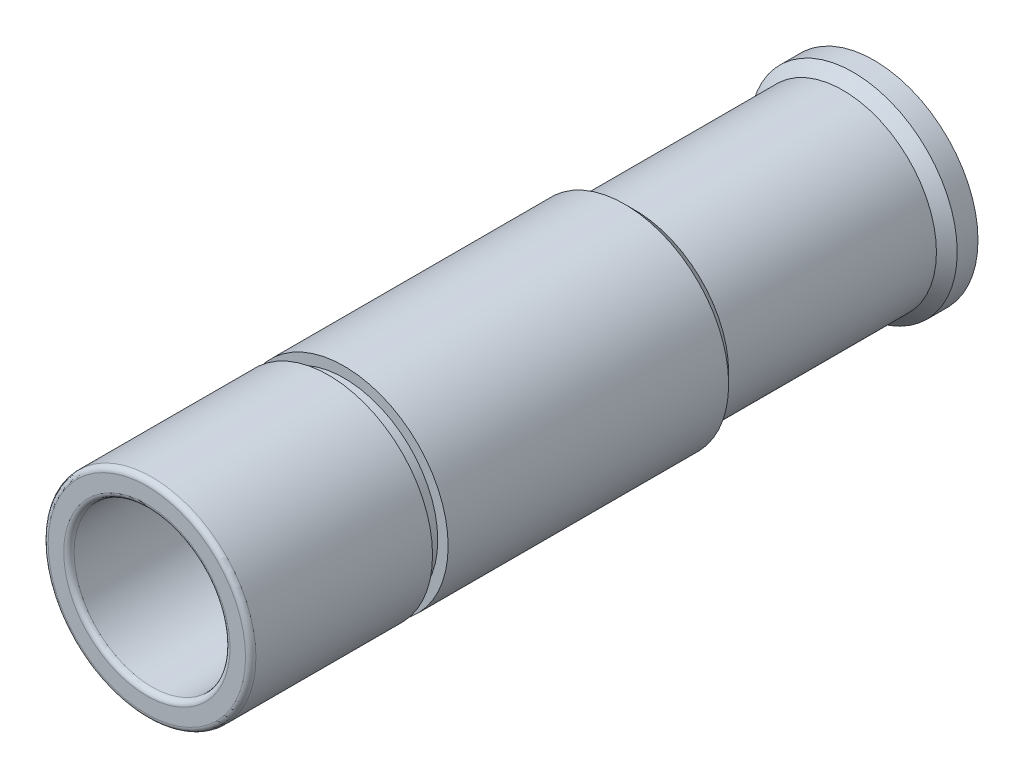
ISO-10303-21;
HEADER;
FILE_DESCRIPTION(('STEP AP214'),'2;1');
FILE_NAME('part.step','',(''),(''),'','','');
FILE_SCHEMA(('AUTOMOTIVE_DESIGN { 1 0 10303 214 1 1 1 1 }'));
ENDSEC;
DATA;
#1=APPLICATION_CONTEXT('core data for automotive mechanical design processes');
#2=APPLICATION_PROTOCOL_DEFINITION('international standard','automotive_design',2000,#1);
#3=PRODUCT_CONTEXT('',#1,'mechanical');
#4=PRODUCT('Part','Part','',(#3));
#5=PRODUCT_RELATED_PRODUCT_CATEGORY('part','',(#4));
#6=PRODUCT_DEFINITION_FORMATION('','',#4);
#7=PRODUCT_DEFINITION_CONTEXT('part definition',#1,'design');
#8=PRODUCT_DEFINITION('design','',#6,#7);
#9=PRODUCT_DEFINITION_SHAPE('','',#8);
#10=(LENGTH_UNIT() NAMED_UNIT(*) SI_UNIT(.MILLI.,.METRE.));
#11=(NAMED_UNIT(*) PLANE_ANGLE_UNIT() SI_UNIT($,.RADIAN.));
#12=(NAMED_UNIT(*) SI_UNIT($,.STERADIAN.) SOLID_ANGLE_UNIT());
#13=UNCERTAINTY_MEASURE_WITH_UNIT(LENGTH_MEASURE(1.E-05),#10,'distance_accuracy_value','');
#14=(GEOMETRIC_REPRESENTATION_CONTEXT(3) GLOBAL_UNCERTAINTY_ASSIGNED_CONTEXT((#13)) GLOBAL_UNIT_ASSIGNED_CONTEXT((#10,
#11,#12)) REPRESENTATION_CONTEXT('',''));
#15=CARTESIAN_POINT('',(0.,0.,0.));
#16=DIRECTION('',(0.,0.,1.));
#17=DIRECTION('',(1.,0.,0.));
#18=AXIS2_PLACEMENT_3D('',#15,#16,#17);
#19=CARTESIAN_POINT('',(0.,4.5,-8.75));
#20=DIRECTION('',(0.,0.,1.));
#21=DIRECTION('',(1.,0.,0.));
#22=AXIS2_PLACEMENT_3D('',#19,#20,#21);
#23=PLANE('',#22);
#24=CARTESIAN_POINT('',(0.,0.,-8.75));
#25=DIRECTION('',(0.,0.,1.));
#26=DIRECTION('',(1.,0.,0.));
#27=AXIS2_PLACEMENT_3D('',#24,#25,#26);
#28=CIRCLE('',#27,5.00000000000003);
#29=CARTESIAN_POINT('',(5.00000000000003,0.,-8.75));
#30=VERTEX_POINT('',#29);
#31=EDGE_CURVE('E79',#30,#30,#28,.T.);
#32=ORIENTED_EDGE('',*,*,#31,.F.);
#33=EDGE_LOOP('',(#32));
#34=FACE_BOUND('',#33,.T.);
#35=CARTESIAN_POINT('',(0.,0.,-8.75));
#36=DIRECTION('',(0.,0.,1.));
#37=DIRECTION('',(1.,0.,0.));
#38=AXIS2_PLACEMENT_3D('',#35,#36,#37);
#39=CIRCLE('',#38,4.50000000000003);
#40=CARTESIAN_POINT('',(4.50000000000003,0.,-8.75));
#41=VERTEX_POINT('',#40);
#42=EDGE_CURVE('E52',#41,#41,#39,.T.);
#43=ORIENTED_EDGE('',*,*,#42,.T.);
#44=EDGE_LOOP('',(#43));
#45=FACE_BOUND('',#44,.T.);
#46=ADVANCED_FACE('F32',(#34,#45),#23,.F.);
#47=CARTESIAN_POINT('',(0.,0.,-23.));
#48=DIRECTION('',(0.,0.,1.));
#49=DIRECTION('',(1.,0.,0.));
#50=AXIS2_PLACEMENT_3D('',#47,#48,#49);
#51=CYLINDRICAL_SURFACE('',#50,4.50000000000003);
#52=ORIENTED_EDGE('',*,*,#42,.F.);
#53=EDGE_LOOP('',(#52));
#54=FACE_BOUND('',#53,.T.);
#55=CARTESIAN_POINT('',(0.,0.,-9.5));
#56=DIRECTION('',(0.,0.,1.));
#57=DIRECTION('',(1.,0.,0.));
#58=AXIS2_PLACEMENT_3D('',#55,#56,#57);
#59=CIRCLE('',#58,4.50000000000003);
#60=CARTESIAN_POINT('',(4.50000000000003,0.,-9.5));
#61=VERTEX_POINT('',#60);
#62=EDGE_CURVE('E55',#61,#61,#59,.T.);
#63=ORIENTED_EDGE('',*,*,#62,.T.);
#64=EDGE_LOOP('',(#63));
#65=FACE_BOUND('',#64,.T.);
#66=ADVANCED_FACE('F87',(#54,#65),#51,.T.);
#67=CARTESIAN_POINT('',(0.,4.5,-9.5));
#68=DIRECTION('',(0.,0.,-1.));
#69=DIRECTION('',(-1.,0.,0.));
#70=AXIS2_PLACEMENT_3D('',#67,#68,#69);
#71=PLANE('',#70);
#72=ORIENTED_EDGE('',*,*,#62,.F.);
#73=EDGE_LOOP('',(#72));
#74=FACE_BOUND('',#73,.T.);
#75=CARTESIAN_POINT('',(0.,0.,-9.5));
#76=DIRECTION('',(0.,0.,1.));
#77=DIRECTION('',(1.,0.,0.));
#78=AXIS2_PLACEMENT_3D('',#75,#76,#77);
#79=CIRCLE('',#78,5.00000000000003);
#80=CARTESIAN_POINT('',(5.00000000000003,0.,-9.5));
#81=VERTEX_POINT('',#80);
#82=EDGE_CURVE('E58',#81,#81,#79,.T.);
#83=ORIENTED_EDGE('',*,*,#82,.T.);
#84=EDGE_LOOP('',(#83));
#85=FACE_BOUND('',#84,.T.);
#86=ADVANCED_FACE('F93',(#74,#85),#71,.F.);
#87=CARTESIAN_POINT('',(0.,0.,-23.));
#88=DIRECTION('',(0.,0.,1.));
#89=DIRECTION('',(1.,0.,0.));
#90=AXIS2_PLACEMENT_3D('',#87,#88,#89);
#91=CYLINDRICAL_SURFACE('',#90,5.00000000000003);
#92=ORIENTED_EDGE('',*,*,#82,.F.);
#93=EDGE_LOOP('',(#92));
#94=FACE_BOUND('',#93,.T.);
#95=CARTESIAN_POINT('',(0.,0.,-23.));
#96=DIRECTION('',(0.,0.,1.));
#97=DIRECTION('',(1.,0.,0.));
#98=AXIS2_PLACEMENT_3D('',#95,#96,#97);
#99=CIRCLE('',#98,5.00000000000003);
#100=CARTESIAN_POINT('',(5.00000000000003,0.,-23.));
#101=VERTEX_POINT('',#100);
#102=EDGE_CURVE('E61',#101,#101,#99,.T.);
#103=ORIENTED_EDGE('',*,*,#102,.T.);
#104=EDGE_LOOP('',(#103));
#105=FACE_BOUND('',#104,.T.);
#106=ADVANCED_FACE('F99',(#94,#105),#91,.T.);
#107=CARTESIAN_POINT('',(0.,0.,-23.5));
#108=DIRECTION('',(0.,0.,1.));
#109=DIRECTION('',(1.,0.,0.));
#110=AXIS2_PLACEMENT_3D('',#107,#108,#109);
#111=CONICAL_SURFACE('',#110,4.50000000000003,0.78539816339745);
#112=ORIENTED_EDGE('',*,*,#102,.F.);
#113=EDGE_LOOP('',(#112));
#114=FACE_BOUND('',#113,.T.);
#115=CARTESIAN_POINT('',(0.,0.,-23.5));
#116=DIRECTION('',(0.,0.,1.));
#117=DIRECTION('',(1.,0.,0.));
#118=AXIS2_PLACEMENT_3D('',#115,#116,#117);
#119=CIRCLE('',#118,4.50000000000003);
#120=CARTESIAN_POINT('',(4.50000000000003,0.,-23.5));
#121=VERTEX_POINT('',#120);
#122=EDGE_CURVE('E64',#121,#121,#119,.T.);
#123=ORIENTED_EDGE('',*,*,#122,.T.);
#124=EDGE_LOOP('',(#123));
#125=FACE_BOUND('',#124,.T.);
#126=ADVANCED_FACE('F105',(#114,#125),#111,.T.);
#127=CARTESIAN_POINT('',(0.,0.,-23.));
#128=DIRECTION('',(0.,0.,1.));
#129=DIRECTION('',(1.,0.,0.));
#130=AXIS2_PLACEMENT_3D('',#127,#128,#129);
#131=CYLINDRICAL_SURFACE('',#130,4.50000000000003);
#132=ORIENTED_EDGE('',*,*,#122,.F.);
#133=EDGE_LOOP('',(#132));
#134=FACE_BOUND('',#133,.T.);
#135=CARTESIAN_POINT('',(0.,0.,-33.5));
#136=DIRECTION('',(0.,0.,1.));
#137=DIRECTION('',(1.,0.,0.));
#138=AXIS2_PLACEMENT_3D('',#135,#136,#137);
#139=CIRCLE('',#138,4.50000000000003);
#140=CARTESIAN_POINT('',(4.50000000000003,0.,-33.5));
#141=VERTEX_POINT('',#140);
#142=EDGE_CURVE('E67',#141,#141,#139,.T.);
#143=ORIENTED_EDGE('',*,*,#142,.T.);
#144=EDGE_LOOP('',(#143));
#145=FACE_BOUND('',#144,.T.);
#146=ADVANCED_FACE('F111',(#134,#145),#131,.T.);
#147=CARTESIAN_POINT('',(0.,0.,-34.));
#148=DIRECTION('',(0.,0.,-1.));
#149=DIRECTION('',(-1.,0.,0.));
#150=AXIS2_PLACEMENT_3D('',#147,#148,#149);
#151=CONICAL_SURFACE('',#150,5.,0.785398163397447);
#152=ORIENTED_EDGE('',*,*,#142,.F.);
#153=EDGE_LOOP('',(#152));
#154=FACE_BOUND('',#153,.T.);
#155=CARTESIAN_POINT('',(0.,0.,-34.));
#156=DIRECTION('',(0.,0.,1.));
#157=DIRECTION('',(1.,0.,0.));
#158=AXIS2_PLACEMENT_3D('',#155,#156,#157);
#159=CIRCLE('',#158,5.);
#160=CARTESIAN_POINT('',(5.,0.,-34.));
#161=VERTEX_POINT('',#160);
#162=EDGE_CURVE('E70',#161,#161,#159,.T.);
#163=ORIENTED_EDGE('',*,*,#162,.T.);
#164=EDGE_LOOP('',(#163));
#165=FACE_BOUND('',#164,.T.);
#166=ADVANCED_FACE('F117',(#154,#165),#151,.T.);
#167=CARTESIAN_POINT('',(0.,0.,-23.));
#168=DIRECTION('',(0.,0.,1.));
#169=DIRECTION('',(1.,0.,0.));
#170=AXIS2_PLACEMENT_3D('',#167,#168,#169);
#171=CYLINDRICAL_SURFACE('',#170,5.);
#172=ORIENTED_EDGE('',*,*,#162,.F.);
#173=EDGE_LOOP('',(#172));
#174=FACE_BOUND('',#173,.T.);
#175=CARTESIAN_POINT('',(0.,0.,-35.));
#176=DIRECTION('',(0.,0.,1.));
#177=DIRECTION('',(1.,0.,0.));
#178=AXIS2_PLACEMENT_3D('',#175,#176,#177);
#179=CIRCLE('',#178,5.);
#180=CARTESIAN_POINT('',(5.,0.,-35.));
#181=VERTEX_POINT('',#180);
#182=EDGE_CURVE('E73',#181,#181,#179,.T.);
#183=ORIENTED_EDGE('',*,*,#182,.T.);
#184=EDGE_LOOP('',(#183));
#185=FACE_BOUND('',#184,.T.);
#186=ADVANCED_FACE('F123',(#174,#185),#171,.T.);
#187=CARTESIAN_POINT('',(0.,4.99999999999997,-35.));
#188=DIRECTION('',(0.,0.,1.));
#189=DIRECTION('',(1.,0.,0.));
#190=AXIS2_PLACEMENT_3D('',#187,#188,#189);
#191=PLANE('',#190);
#192=ORIENTED_EDGE('',*,*,#182,.F.);
#193=EDGE_LOOP('',(#192));
#194=FACE_BOUND('',#193,.T.);
#195=ADVANCED_FACE('F129',(#194),#191,.F.);
#196=CARTESIAN_POINT('',(0.,3.74999999999997,-23.));
#197=DIRECTION('',(0.,0.,-1.));
#198=DIRECTION('',(-1.,0.,0.));
#199=AXIS2_PLACEMENT_3D('',#196,#197,#198);
#200=PLANE('',#199);
#201=CARTESIAN_POINT('',(0.,0.,-23.));
#202=DIRECTION('',(0.,0.,1.));
#203=DIRECTION('',(1.,0.,0.));
#204=AXIS2_PLACEMENT_3D('',#201,#202,#203);
#205=CIRCLE('',#204,3.75);
#206=CARTESIAN_POINT('',(3.75,0.,-23.));
#207=VERTEX_POINT('',#206);
#208=EDGE_CURVE('E76',#207,#207,#205,.T.);
#209=ORIENTED_EDGE('',*,*,#208,.T.);
#210=EDGE_LOOP('',(#209));
#211=FACE_BOUND('',#210,.T.);
#212=ADVANCED_FACE('F134',(#211),#200,.F.);
#213=CARTESIAN_POINT('',(0.,0.,-23.));
#214=DIRECTION('',(0.,0.,1.));
#215=DIRECTION('',(1.,0.,0.));
#216=AXIS2_PLACEMENT_3D('',#213,#214,#215);
#217=CYLINDRICAL_SURFACE('',#216,3.75);
#218=CARTESIAN_POINT('',(0.,0.,-0.25));
#219=DIRECTION('',(0.,0.,-1.));
#220=DIRECTION('',(-1.,0.,0.));
#221=AXIS2_PLACEMENT_3D('',#218,#219,#220);
#222=CIRCLE('',#221,3.75);
#223=CARTESIAN_POINT('',(-3.75,0.,-0.25));
#224=VERTEX_POINT('',#223);
#225=EDGE_CURVE('E47',#224,#224,#222,.F.);
#226=ORIENTED_EDGE('',*,*,#225,.T.);
#227=EDGE_LOOP('',(#226));
#228=FACE_BOUND('',#227,.T.);
#229=ORIENTED_EDGE('',*,*,#208,.F.);
#230=EDGE_LOOP('',(#229));
#231=FACE_BOUND('',#230,.T.);
#232=ADVANCED_FACE('F139',(#228,#231),#217,.F.);
#233=CARTESIAN_POINT('',(0.,3.74999999999997,0.));
#234=DIRECTION('',(0.,0.,-1.));
#235=DIRECTION('',(-1.,0.,0.));
#236=AXIS2_PLACEMENT_3D('',#233,#234,#235);
#237=PLANE('',#236);
#238=CARTESIAN_POINT('',(0.,0.,0.));
#239=DIRECTION('',(0.,0.,-1.));
#240=DIRECTION('',(-1.,0.,0.));
#241=AXIS2_PLACEMENT_3D('',#238,#239,#240);
#242=CIRCLE('',#241,4.);
#243=CARTESIAN_POINT('',(-4.,0.,0.));
#244=VERTEX_POINT('',#243);
#245=EDGE_CURVE('E39',#244,#244,#242,.T.);
#246=ORIENTED_EDGE('',*,*,#245,.T.);
#247=EDGE_LOOP('',(#246));
#248=FACE_BOUND('',#247,.T.);
#249=CARTESIAN_POINT('',(0.,0.,0.));
#250=DIRECTION('',(0.,0.,-1.));
#251=DIRECTION('',(-1.,0.,0.));
#252=AXIS2_PLACEMENT_3D('',#249,#250,#251);
#253=CIRCLE('',#252,4.75000000000003);
#254=CARTESIAN_POINT('',(-4.75000000000003,0.,0.));
#255=VERTEX_POINT('',#254);
#256=EDGE_CURVE('E43',#255,#255,#253,.F.);
#257=ORIENTED_EDGE('',*,*,#256,.T.);
#258=EDGE_LOOP('',(#257));
#259=FACE_BOUND('',#258,.T.);
#260=ADVANCED_FACE('F151',(#248,#259),#237,.F.);
#261=CARTESIAN_POINT('',(0.,0.,-23.));
#262=DIRECTION('',(0.,0.,1.));
#263=DIRECTION('',(1.,0.,0.));
#264=AXIS2_PLACEMENT_3D('',#261,#262,#263);
#265=CYLINDRICAL_SURFACE('',#264,5.00000000000003);
#266=CARTESIAN_POINT('',(0.,0.,-0.25));
#267=DIRECTION('',(0.,0.,-1.));
#268=DIRECTION('',(-1.,0.,0.));
#269=AXIS2_PLACEMENT_3D('',#266,#267,#268);
#270=CIRCLE('',#269,5.00000000000003);
#271=CARTESIAN_POINT('',(-5.00000000000003,0.,-0.25));
#272=VERTEX_POINT('',#271);
#273=EDGE_CURVE('E10',#272,#272,#270,.T.);
#274=ORIENTED_EDGE('',*,*,#273,.T.);
#275=EDGE_LOOP('',(#274));
#276=FACE_BOUND('',#275,.T.);
#277=ORIENTED_EDGE('',*,*,#31,.T.);
#278=EDGE_LOOP('',(#277));
#279=FACE_BOUND('',#278,.T.);
#280=ADVANCED_FACE('F83',(#276,#279),#265,.T.);
#281=CARTESIAN_POINT('',(0.,0.,-0.25));
#282=DIRECTION('',(0.,0.,-1.));
#283=DIRECTION('',(-1.,0.,0.));
#284=AXIS2_PLACEMENT_3D('',#281,#282,#283);
#285=TOROIDAL_SURFACE('',#284,4.,0.25);
#286=ORIENTED_EDGE('',*,*,#245,.F.);
#287=EDGE_LOOP('',(#286));
#288=FACE_BOUND('',#287,.T.);
#289=ORIENTED_EDGE('',*,*,#225,.F.);
#290=EDGE_LOOP('',(#289));
#291=FACE_BOUND('',#290,.T.);
#292=ADVANCED_FACE('F143',(#288,#291),#285,.T.);
#293=CARTESIAN_POINT('',(0.,0.,-0.25));
#294=DIRECTION('',(0.,0.,-1.));
#295=DIRECTION('',(-1.,0.,0.));
#296=AXIS2_PLACEMENT_3D('',#293,#294,#295);
#297=TOROIDAL_SURFACE('',#296,4.75000000000003,0.25);
#298=ORIENTED_EDGE('',*,*,#273,.F.);
#299=EDGE_LOOP('',(#298));
#300=FACE_BOUND('',#299,.T.);
#301=ORIENTED_EDGE('',*,*,#256,.F.);
#302=EDGE_LOOP('',(#301));
#303=FACE_BOUND('',#302,.T.);
#304=ADVANCED_FACE('F34',(#300,#303),#297,.T.);
#305=CLOSED_SHELL('',(#46,#66,#86,#106,#126,#146,#166,#186,#195,#212,#232,#260,#280,#292,#304));
#306=MANIFOLD_SOLID_BREP('B2',#305);
#307=ADVANCED_BREP_SHAPE_REPRESENTATION('',(#18,#306),#14);
#308=SHAPE_DEFINITION_REPRESENTATION(#9,#307);
ENDSEC;
END-ISO-10303-21;
